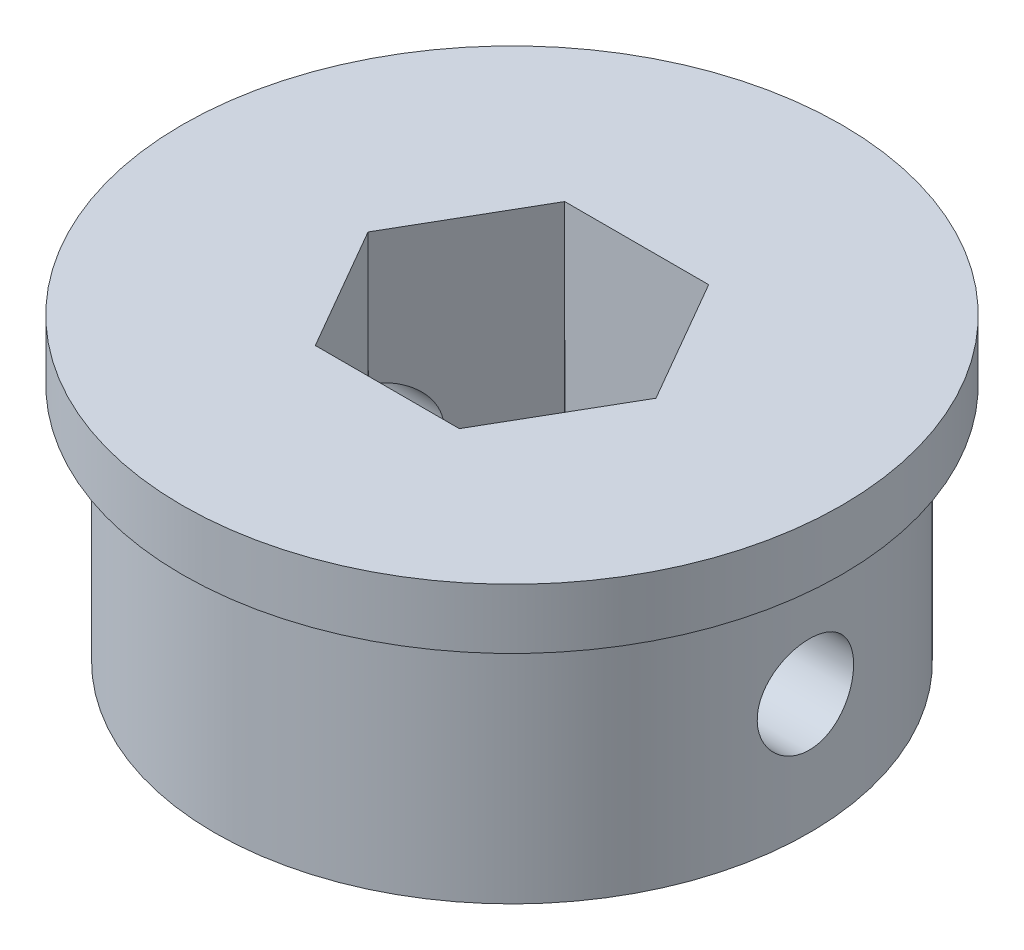
ISO-10303-21;
HEADER;
FILE_DESCRIPTION(('STEP AP214'),'2;1');
FILE_NAME('part.step','',(''),(''),'','','');
FILE_SCHEMA(('AUTOMOTIVE_DESIGN { 1 0 10303 214 1 1 1 1 }'));
ENDSEC;
DATA;
#1=APPLICATION_CONTEXT('core data for automotive mechanical design processes');
#2=APPLICATION_PROTOCOL_DEFINITION('international standard','automotive_design',2000,#1);
#3=PRODUCT_CONTEXT('',#1,'mechanical');
#4=PRODUCT('Part','Part','',(#3));
#5=PRODUCT_RELATED_PRODUCT_CATEGORY('part','',(#4));
#6=PRODUCT_DEFINITION_FORMATION('','',#4);
#7=PRODUCT_DEFINITION_CONTEXT('part definition',#1,'design');
#8=PRODUCT_DEFINITION('design','',#6,#7);
#9=PRODUCT_DEFINITION_SHAPE('','',#8);
#10=(LENGTH_UNIT() NAMED_UNIT(*) SI_UNIT(.MILLI.,.METRE.));
#11=(NAMED_UNIT(*) PLANE_ANGLE_UNIT() SI_UNIT($,.RADIAN.));
#12=(NAMED_UNIT(*) SI_UNIT($,.STERADIAN.) SOLID_ANGLE_UNIT());
#13=UNCERTAINTY_MEASURE_WITH_UNIT(LENGTH_MEASURE(1.E-05),#10,'distance_accuracy_value','');
#14=(GEOMETRIC_REPRESENTATION_CONTEXT(3) GLOBAL_UNCERTAINTY_ASSIGNED_CONTEXT((#13)) GLOBAL_UNIT_ASSIGNED_CONTEXT((#10,
#11,#12)) REPRESENTATION_CONTEXT('',''));
#15=CARTESIAN_POINT('',(0.,0.,0.));
#16=DIRECTION('',(0.,0.,1.));
#17=DIRECTION('',(1.,0.,0.));
#18=AXIS2_PLACEMENT_3D('',#15,#16,#17);
#19=CARTESIAN_POINT('',(0.,-9.525,0.));
#20=DIRECTION('',(0.,1.,0.));
#21=DIRECTION('',(0.,0.,1.));
#22=AXIS2_PLACEMENT_3D('',#19,#20,#21);
#23=CYLINDRICAL_SURFACE('',#22,7.62);
#24=DIRECTION('',(0.,-1.,0.));
#25=VECTOR('',#24,1.);
#26=CARTESIAN_POINT('',(7.6199937190736,7.67063178623506,-0.00978372520881203));
#27=LINE('',#26,#25);
#28=CARTESIAN_POINT('',(7.61999371907359,0.,-0.00978372520881116));
#29=VERTEX_POINT('',#28);
#30=CARTESIAN_POINT('',(7.6199937190736,-0.622318749095171,-0.00978372520881203));
#31=VERTEX_POINT('',#30);
#32=EDGE_CURVE('E214',#29,#31,#27,.T.);
#33=ORIENTED_EDGE('',*,*,#32,.T.);
#34=CARTESIAN_POINT('',(7.61999371907359,-0.622318749095171,-0.00978372520881133));
#35=CARTESIAN_POINT('',(7.61999790635786,-0.62230624969839,-0.00652248347254017));
#36=CARTESIAN_POINT('',(7.62,-0.622299999999999,-0.00326124173626901));
#37=CARTESIAN_POINT('',(7.62,-0.622299999999999,0.00326124173627332));
#38=CARTESIAN_POINT('',(7.61999790635786,-0.62230624969839,0.00652248347254449));
#39=CARTESIAN_POINT('',(7.61999371907359,-0.622318749095171,0.00978372520881565));
#40=B_SPLINE_CURVE_WITH_KNOTS('',3,(#34,#35,#36,#37,#38,#39),.UNSPECIFIED.,.F.,.F.,(4,2,4),(0.,
0.00978374518986359,0.0195674903797272),.UNSPECIFIED.);
#41=CARTESIAN_POINT('',(7.61999371907359,-0.622318749095171,0.00978372520881565));
#42=VERTEX_POINT('',#41);
#43=EDGE_CURVE('E67',#31,#42,#40,.T.);
#44=ORIENTED_EDGE('',*,*,#43,.T.);
#45=DIRECTION('',(0.,-1.,0.));
#46=VECTOR('',#45,1.);
#47=CARTESIAN_POINT('',(7.61999371907359,7.67063178623506,0.00978372520881506));
#48=LINE('',#47,#46);
#49=CARTESIAN_POINT('',(7.61999371907359,0.,0.00978372520880986));
#50=VERTEX_POINT('',#49);
#51=EDGE_CURVE('E261',#50,#42,#48,.T.);
#52=ORIENTED_EDGE('',*,*,#51,.F.);
#53=CARTESIAN_POINT('',(0.,0.,0.));
#54=DIRECTION('',(0.,1.,0.));
#55=DIRECTION('',(0.,0.,1.));
#56=AXIS2_PLACEMENT_3D('',#53,#54,#55);
#57=CIRCLE('',#56,7.62);
#58=EDGE_CURVE('E276',#50,#29,#57,.T.);
#59=ORIENTED_EDGE('',*,*,#58,.T.);
#60=EDGE_LOOP('',(#33,#44,#52,#59));
#61=FACE_BOUND('',#60,.T.);
#62=ADVANCED_FACE('F37',(#61),#23,.F.);
#63=DIRECTION('',(0.,-1.,0.));
#64=VECTOR('',#63,1.);
#65=CARTESIAN_POINT('',(-7.61999371907359,7.67063178623506,0.00978372520881506));
#66=LINE('',#65,#64);
#67=CARTESIAN_POINT('',(-7.61999371907359,0.,0.00978372520881723));
#68=VERTEX_POINT('',#67);
#69=CARTESIAN_POINT('',(-7.61999371907359,-0.622318749095171,0.00978372520881379));
#70=VERTEX_POINT('',#69);
#71=EDGE_CURVE('E246',#68,#70,#66,.T.);
#72=ORIENTED_EDGE('',*,*,#71,.T.);
#73=CARTESIAN_POINT('',(-7.61999371907359,-0.622318749095171,0.00978372520881379));
#74=CARTESIAN_POINT('',(-7.61999790635786,-0.62230624969839,0.00652248347254206));
#75=CARTESIAN_POINT('',(-7.62,-0.622299999999999,0.00326124173627033));
#76=CARTESIAN_POINT('',(-7.62,-0.622299999999999,-0.00326124173627313));
#77=CARTESIAN_POINT('',(-7.61999790635786,-0.62230624969839,-0.00652248347254486));
#78=CARTESIAN_POINT('',(-7.61999371907359,-0.622318749095171,-0.00978372520881659));
#79=B_SPLINE_CURVE_WITH_KNOTS('',3,(#73,#74,#75,#76,#77,#78),.UNSPECIFIED.,.F.,.F.,(4,2,4),(0.,
0.00978374518986528,0.0195674903797306),.UNSPECIFIED.);
#80=CARTESIAN_POINT('',(-7.61999371907359,-0.622318749095171,-0.0097837252088181));
#81=VERTEX_POINT('',#80);
#82=EDGE_CURVE('E377',#70,#81,#79,.T.);
#83=ORIENTED_EDGE('',*,*,#82,.T.);
#84=DIRECTION('',(0.,-1.,0.));
#85=VECTOR('',#84,1.);
#86=CARTESIAN_POINT('',(-7.61999371907359,7.67063178623506,-0.0097837252088181));
#87=LINE('',#86,#85);
#88=CARTESIAN_POINT('',(-7.61999371907359,0.,-0.0097837252088181));
#89=VERTEX_POINT('',#88);
#90=EDGE_CURVE('E233',#89,#81,#87,.T.);
#91=ORIENTED_EDGE('',*,*,#90,.F.);
#92=EDGE_CURVE('E435',#89,#68,#57,.T.);
#93=ORIENTED_EDGE('',*,*,#92,.T.);
#94=EDGE_LOOP('',(#72,#83,#91,#93));
#95=FACE_BOUND('',#94,.T.);
#96=ADVANCED_FACE('F461',(#95),#23,.F.);
#97=CARTESIAN_POINT('',(7.61999371907359,-5.72768125090483,0.00978372520881565));
#98=VERTEX_POINT('',#97);
#99=CARTESIAN_POINT('',(7.61999371907359,-9.525,0.00978372520881506));
#100=VERTEX_POINT('',#99);
#101=EDGE_CURVE('E207',#98,#100,#48,.T.);
#102=ORIENTED_EDGE('',*,*,#101,.F.);
#103=CARTESIAN_POINT('',(7.61999371907359,-5.72768125090483,0.00978372520881565));
#104=CARTESIAN_POINT('',(7.61999790635786,-5.72769375030161,0.00652248347254449));
#105=CARTESIAN_POINT('',(7.62,-5.7277,0.00326124173627332));
#106=CARTESIAN_POINT('',(7.62,-5.7277,-0.00326124173626901));
#107=CARTESIAN_POINT('',(7.61999790635786,-5.72769375030161,-0.00652248347254017));
#108=CARTESIAN_POINT('',(7.61999371907359,-5.72768125090483,-0.00978372520881134));
#109=B_SPLINE_CURVE_WITH_KNOTS('',3,(#103,#104,#105,#106,#107,#108),.UNSPECIFIED.,.F.,.F.,(4,2,
4),(0.,0.00978374518986359,0.0195674903797272),.UNSPECIFIED.);
#110=CARTESIAN_POINT('',(7.6199937190736,-5.72768125090483,-0.00978372520881203));
#111=VERTEX_POINT('',#110);
#112=EDGE_CURVE('E194',#98,#111,#109,.T.);
#113=ORIENTED_EDGE('',*,*,#112,.T.);
#114=CARTESIAN_POINT('',(7.61999371907359,-9.525,-0.00978372520881203));
#115=VERTEX_POINT('',#114);
#116=EDGE_CURVE('E205',#111,#115,#27,.T.);
#117=ORIENTED_EDGE('',*,*,#116,.T.);
#118=CARTESIAN_POINT('',(0.,-9.525,0.));
#119=DIRECTION('',(0.,1.,0.));
#120=DIRECTION('',(0.,0.,1.));
#121=AXIS2_PLACEMENT_3D('',#118,#119,#120);
#122=CIRCLE('',#121,7.62);
#123=EDGE_CURVE('E268',#100,#115,#122,.T.);
#124=ORIENTED_EDGE('',*,*,#123,.F.);
#125=EDGE_LOOP('',(#102,#113,#117,#124));
#126=FACE_BOUND('',#125,.T.);
#127=ADVANCED_FACE('F203',(#126),#23,.F.);
#128=CARTESIAN_POINT('',(3.81846981411128,-9.525,-6.59421627479119));
#129=VERTEX_POINT('',#128);
#130=CARTESIAN_POINT('',(3.80152390496231,-9.525,-6.604));
#131=VERTEX_POINT('',#130);
#132=EDGE_CURVE('E271',#129,#131,#122,.T.);
#133=ORIENTED_EDGE('',*,*,#132,.F.);
#134=DIRECTION('',(0.,-1.,0.));
#135=VECTOR('',#134,1.);
#136=CARTESIAN_POINT('',(3.81846981411128,7.67063178623506,-6.59421627479119));
#137=LINE('',#136,#135);
#138=CARTESIAN_POINT('',(3.81846981411128,0.,-6.59421627479119));
#139=VERTEX_POINT('',#138);
#140=EDGE_CURVE('E215',#139,#129,#137,.T.);
#141=ORIENTED_EDGE('',*,*,#140,.F.);
#142=CARTESIAN_POINT('',(3.80152390496231,0.,-6.604));
#143=VERTEX_POINT('',#142);
#144=EDGE_CURVE('E430',#139,#143,#57,.T.);
#145=ORIENTED_EDGE('',*,*,#144,.T.);
#146=DIRECTION('',(0.,-1.,0.));
#147=VECTOR('',#146,1.);
#148=CARTESIAN_POINT('',(3.80152390496231,7.67063178623506,-6.604));
#149=LINE('',#148,#147);
#150=EDGE_CURVE('E226',#143,#131,#149,.T.);
#151=ORIENTED_EDGE('',*,*,#150,.T.);
#152=EDGE_LOOP('',(#133,#141,#145,#151));
#153=FACE_BOUND('',#152,.T.);
#154=ADVANCED_FACE('F493',(#153),#23,.F.);
#155=CARTESIAN_POINT('',(-3.80152390496231,-9.525,-6.604));
#156=VERTEX_POINT('',#155);
#157=CARTESIAN_POINT('',(-3.81846981411128,-9.525,-6.59421627479118));
#158=VERTEX_POINT('',#157);
#159=EDGE_CURVE('E451',#156,#158,#122,.T.);
#160=ORIENTED_EDGE('',*,*,#159,.F.);
#161=DIRECTION('',(0.,-1.,0.));
#162=VECTOR('',#161,1.);
#163=CARTESIAN_POINT('',(-3.80152390496231,7.67063178623506,-6.604));
#164=LINE('',#163,#162);
#165=CARTESIAN_POINT('',(-3.80152390496231,0.,-6.604));
#166=VERTEX_POINT('',#165);
#167=EDGE_CURVE('E223',#166,#156,#164,.T.);
#168=ORIENTED_EDGE('',*,*,#167,.F.);
#169=CARTESIAN_POINT('',(-3.81846981411128,0.,-6.59421627479119));
#170=VERTEX_POINT('',#169);
#171=EDGE_CURVE('E431',#166,#170,#57,.T.);
#172=ORIENTED_EDGE('',*,*,#171,.T.);
#173=DIRECTION('',(0.,-1.,0.));
#174=VECTOR('',#173,1.);
#175=CARTESIAN_POINT('',(-3.81846981411128,7.67063178623506,-6.59421627479118));
#176=LINE('',#175,#174);
#177=EDGE_CURVE('E236',#170,#158,#176,.T.);
#178=ORIENTED_EDGE('',*,*,#177,.T.);
#179=EDGE_LOOP('',(#160,#168,#172,#178));
#180=FACE_BOUND('',#179,.T.);
#181=ADVANCED_FACE('F455',(#180),#23,.F.);
#182=CARTESIAN_POINT('',(-7.61999371907359,-5.72768125090483,-0.0097837252088181));
#183=VERTEX_POINT('',#182);
#184=CARTESIAN_POINT('',(-7.61999371907359,-9.525,-0.0097837252088181));
#185=VERTEX_POINT('',#184);
#186=EDGE_CURVE('E232',#183,#185,#87,.T.);
#187=ORIENTED_EDGE('',*,*,#186,.F.);
#188=CARTESIAN_POINT('',(-7.61999371907359,-5.72768125090483,-0.00978372520881658));
#189=CARTESIAN_POINT('',(-7.61999790635786,-5.72769375030161,-0.00652248347254486));
#190=CARTESIAN_POINT('',(-7.62,-5.7277,-0.00326124173627313));
#191=CARTESIAN_POINT('',(-7.62,-5.7277,0.00326124173627033));
#192=CARTESIAN_POINT('',(-7.61999790635786,-5.72769375030161,0.00652248347254206));
#193=CARTESIAN_POINT('',(-7.61999371907359,-5.72768125090483,0.00978372520881379));
#194=B_SPLINE_CURVE_WITH_KNOTS('',3,(#188,#189,#190,#191,#192,#193),.UNSPECIFIED.,.F.,.F.,(4,2,
4),(0.,0.00978374518986528,0.0195674903797306),.UNSPECIFIED.);
#195=CARTESIAN_POINT('',(-7.61999371907359,-5.72768125090483,0.00978372520881379));
#196=VERTEX_POINT('',#195);
#197=EDGE_CURVE('E59',#183,#196,#194,.T.);
#198=ORIENTED_EDGE('',*,*,#197,.T.);
#199=CARTESIAN_POINT('',(-7.61999371907359,-9.525,0.00978372520881506));
#200=VERTEX_POINT('',#199);
#201=EDGE_CURVE('E245',#196,#200,#66,.T.);
#202=ORIENTED_EDGE('',*,*,#201,.T.);
#203=EDGE_CURVE('E450',#185,#200,#122,.T.);
#204=ORIENTED_EDGE('',*,*,#203,.F.);
#205=EDGE_LOOP('',(#187,#198,#202,#204));
#206=FACE_BOUND('',#205,.T.);
#207=ADVANCED_FACE('F458',(#206),#23,.F.);
#208=CARTESIAN_POINT('',(-3.81846981411128,-9.525,6.59421627479119));
#209=VERTEX_POINT('',#208);
#210=CARTESIAN_POINT('',(-3.80152390496231,-9.525,6.604));
#211=VERTEX_POINT('',#210);
#212=EDGE_CURVE('E447',#209,#211,#122,.T.);
#213=ORIENTED_EDGE('',*,*,#212,.F.);
#214=DIRECTION('',(0.,-1.,0.));
#215=VECTOR('',#214,1.);
#216=CARTESIAN_POINT('',(-3.81846981411128,7.67063178623506,6.59421627479119));
#217=LINE('',#216,#215);
#218=CARTESIAN_POINT('',(-3.81846981411128,0.,6.59421627479119));
#219=VERTEX_POINT('',#218);
#220=EDGE_CURVE('E242',#219,#209,#217,.T.);
#221=ORIENTED_EDGE('',*,*,#220,.F.);
#222=CARTESIAN_POINT('',(-3.80152390496232,0.,6.604));
#223=VERTEX_POINT('',#222);
#224=EDGE_CURVE('E267',#219,#223,#57,.T.);
#225=ORIENTED_EDGE('',*,*,#224,.T.);
#226=DIRECTION('',(0.,-1.,0.));
#227=VECTOR('',#226,1.);
#228=CARTESIAN_POINT('',(-3.80152390496232,7.67063178623506,6.604));
#229=LINE('',#228,#227);
#230=EDGE_CURVE('E255',#223,#211,#229,.T.);
#231=ORIENTED_EDGE('',*,*,#230,.T.);
#232=EDGE_LOOP('',(#213,#221,#225,#231));
#233=FACE_BOUND('',#232,.T.);
#234=ADVANCED_FACE('F443',(#233),#23,.F.);
#235=CARTESIAN_POINT('',(0.,0.,0.));
#236=DIRECTION('',(0.,1.,0.));
#237=DIRECTION('',(0.,0.,1.));
#238=AXIS2_PLACEMENT_3D('',#235,#236,#237);
#239=PLANE('',#238);
#240=CARTESIAN_POINT('',(3.80152390496231,0.,6.604));
#241=VERTEX_POINT('',#240);
#242=CARTESIAN_POINT('',(3.81846981411128,0.,6.59421627479119));
#243=VERTEX_POINT('',#242);
#244=EDGE_CURVE('E273',#241,#243,#57,.T.);
#245=ORIENTED_EDGE('',*,*,#244,.F.);
#246=DIRECTION('',(1.,0.,0.));
#247=VECTOR('',#246,1.);
#248=CARTESIAN_POINT('',(0.,0.,6.604));
#249=LINE('',#248,#247);
#250=CARTESIAN_POINT('',(3.81282117772829,0.,6.604));
#251=VERTEX_POINT('',#250);
#252=EDGE_CURVE('E309',#241,#251,#249,.T.);
#253=ORIENTED_EDGE('',*,*,#252,.T.);
#254=DIRECTION('',(0.5,0.,-0.866025403784439));
#255=VECTOR('',#254,1.);
#256=CARTESIAN_POINT('',(5.71923176659243,0.,3.302));
#257=LINE('',#256,#255);
#258=EDGE_CURVE('E306',#251,#243,#257,.T.);
#259=ORIENTED_EDGE('',*,*,#258,.T.);
#260=EDGE_LOOP('',(#245,#253,#259));
#261=FACE_BOUND('',#260,.T.);
#262=ADVANCED_FACE('F397',(#261),#239,.T.);
#263=ORIENTED_EDGE('',*,*,#58,.F.);
#264=CARTESIAN_POINT('',(7.62564235545658,0.,0.));
#265=VERTEX_POINT('',#264);
#266=EDGE_CURVE('E283',#50,#265,#257,.T.);
#267=ORIENTED_EDGE('',*,*,#266,.T.);
#268=DIRECTION('',(-0.5,0.,-0.866025403784439));
#269=VECTOR('',#268,1.);
#270=CARTESIAN_POINT('',(5.71923176659243,0.,-3.302));
#271=LINE('',#270,#269);
#272=EDGE_CURVE('E290',#265,#29,#271,.T.);
#273=ORIENTED_EDGE('',*,*,#272,.T.);
#274=EDGE_LOOP('',(#263,#267,#273));
#275=FACE_BOUND('',#274,.T.);
#276=ADVANCED_FACE('F428',(#275),#239,.T.);
#277=ORIENTED_EDGE('',*,*,#144,.F.);
#278=CARTESIAN_POINT('',(3.81282117772829,0.,-6.604));
#279=VERTEX_POINT('',#278);
#280=EDGE_CURVE('E325',#139,#279,#271,.T.);
#281=ORIENTED_EDGE('',*,*,#280,.T.);
#282=DIRECTION('',(-1.,0.,0.));
#283=VECTOR('',#282,1.);
#284=CARTESIAN_POINT('',(0.,0.,-6.604));
#285=LINE('',#284,#283);
#286=EDGE_CURVE('E322',#279,#143,#285,.T.);
#287=ORIENTED_EDGE('',*,*,#286,.T.);
#288=EDGE_LOOP('',(#277,#281,#287));
#289=FACE_BOUND('',#288,.T.);
#290=ADVANCED_FACE('F471',(#289),#239,.T.);
#291=ORIENTED_EDGE('',*,*,#171,.F.);
#292=CARTESIAN_POINT('',(-3.81282117772829,0.,-6.604));
#293=VERTEX_POINT('',#292);
#294=EDGE_CURVE('E321',#166,#293,#285,.T.);
#295=ORIENTED_EDGE('',*,*,#294,.T.);
#296=DIRECTION('',(-0.5,0.,0.866025403784439));
#297=VECTOR('',#296,1.);
#298=CARTESIAN_POINT('',(-5.71923176659244,0.,-3.302));
#299=LINE('',#298,#297);
#300=EDGE_CURVE('E318',#293,#170,#299,.T.);
#301=ORIENTED_EDGE('',*,*,#300,.T.);
#302=EDGE_LOOP('',(#291,#295,#301));
#303=FACE_BOUND('',#302,.T.);
#304=ADVANCED_FACE('F465',(#303),#239,.T.);
#305=ORIENTED_EDGE('',*,*,#92,.F.);
#306=CARTESIAN_POINT('',(-7.62564235545658,0.,0.));
#307=VERTEX_POINT('',#306);
#308=EDGE_CURVE('E317',#89,#307,#299,.T.);
#309=ORIENTED_EDGE('',*,*,#308,.T.);
#310=DIRECTION('',(0.5,0.,0.866025403784439));
#311=VECTOR('',#310,1.);
#312=CARTESIAN_POINT('',(-5.71923176659244,0.,3.302));
#313=LINE('',#312,#311);
#314=EDGE_CURVE('E314',#307,#68,#313,.T.);
#315=ORIENTED_EDGE('',*,*,#314,.T.);
#316=EDGE_LOOP('',(#305,#309,#315));
#317=FACE_BOUND('',#316,.T.);
#318=ADVANCED_FACE('F463',(#317),#239,.T.);
#319=CARTESIAN_POINT('',(5.71923176659243,6.35,3.302));
#320=DIRECTION('',(-0.866025403784439,0.,-0.5));
#321=DIRECTION('',(-0.5,0.,0.866025403784439));
#322=AXIS2_PLACEMENT_3D('',#319,#320,#321);
#323=PLANE('',#322);
#324=CARTESIAN_POINT('',(7.62564235545658,-3.175,0.));
#325=DIRECTION('',(-0.866025403784439,0.,-0.5));
#326=DIRECTION('',(0.5,0.,-0.866025403784439));
#327=AXIS2_PLACEMENT_3D('',#324,#325,#326);
#328=ELLIPSE('',#327,2.94760406432072,2.5527);
#329=EDGE_CURVE('E727',#98,#42,#328,.T.);
#330=ORIENTED_EDGE('',*,*,#329,.F.);
#331=ORIENTED_EDGE('',*,*,#101,.T.);
#332=DIRECTION('',(0.5,0.,-0.866025403784439));
#333=VECTOR('',#332,1.);
#334=CARTESIAN_POINT('',(5.71923176659244,-9.525,3.302));
#335=LINE('',#334,#333);
#336=CARTESIAN_POINT('',(3.81846981411128,-9.525,6.59421627479119));
#337=VERTEX_POINT('',#336);
#338=EDGE_CURVE('E258',#337,#100,#335,.T.);
#339=ORIENTED_EDGE('',*,*,#338,.F.);
#340=DIRECTION('',(0.,-1.,0.));
#341=VECTOR('',#340,1.);
#342=CARTESIAN_POINT('',(3.81846981411128,7.67063178623506,6.59421627479119));
#343=LINE('',#342,#341);
#344=EDGE_CURVE('E264',#243,#337,#343,.T.);
#345=ORIENTED_EDGE('',*,*,#344,.F.);
#346=ORIENTED_EDGE('',*,*,#258,.F.);
#347=DIRECTION('',(0.,-1.,0.));
#348=VECTOR('',#347,1.);
#349=CARTESIAN_POINT('',(3.81282117772829,6.35,6.604));
#350=LINE('',#349,#348);
#351=CARTESIAN_POINT('',(3.81282117772829,6.35,6.604));
#352=VERTEX_POINT('',#351);
#353=EDGE_CURVE('E51',#352,#251,#350,.T.);
#354=ORIENTED_EDGE('',*,*,#353,.F.);
#355=DIRECTION('',(0.5,0.,-0.866025403784439));
#356=VECTOR('',#355,1.);
#357=CARTESIAN_POINT('',(5.71923176659243,6.35,3.302));
#358=LINE('',#357,#356);
#359=CARTESIAN_POINT('',(7.62564235545658,6.35,0.));
#360=VERTEX_POINT('',#359);
#361=EDGE_CURVE('E286',#352,#360,#358,.T.);
#362=ORIENTED_EDGE('',*,*,#361,.T.);
#363=DIRECTION('',(0.,-1.,0.));
#364=VECTOR('',#363,1.);
#365=CARTESIAN_POINT('',(7.62564235545658,6.35,0.));
#366=LINE('',#365,#364);
#367=EDGE_CURVE('E305',#360,#265,#366,.T.);
#368=ORIENTED_EDGE('',*,*,#367,.T.);
#369=ORIENTED_EDGE('',*,*,#266,.F.);
#370=ORIENTED_EDGE('',*,*,#51,.T.);
#371=EDGE_LOOP('',(#330,#331,#339,#345,#346,#354,#362,#368,#369,#370));
#372=FACE_BOUND('',#371,.T.);
#373=ADVANCED_FACE('F391',(#372),#323,.T.);
#374=CARTESIAN_POINT('',(0.,6.35,6.604));
#375=DIRECTION('',(0.,0.,-1.));
#376=DIRECTION('',(-1.,0.,0.));
#377=AXIS2_PLACEMENT_3D('',#374,#375,#376);
#378=PLANE('',#377);
#379=CARTESIAN_POINT('',(-3.81282117772829,0.,6.604));
#380=VERTEX_POINT('',#379);
#381=EDGE_CURVE('E310',#380,#223,#249,.T.);
#382=ORIENTED_EDGE('',*,*,#381,.F.);
#383=DIRECTION('',(0.,-1.,0.));
#384=VECTOR('',#383,1.);
#385=CARTESIAN_POINT('',(-3.81282117772829,6.35,6.604));
#386=LINE('',#385,#384);
#387=CARTESIAN_POINT('',(-3.81282117772829,6.35,6.604));
#388=VERTEX_POINT('',#387);
#389=EDGE_CURVE('E339',#388,#380,#386,.T.);
#390=ORIENTED_EDGE('',*,*,#389,.F.);
#391=DIRECTION('',(1.,0.,0.));
#392=VECTOR('',#391,1.);
#393=CARTESIAN_POINT('',(0.,6.35,6.604));
#394=LINE('',#393,#392);
#395=EDGE_CURVE('E289',#388,#352,#394,.T.);
#396=ORIENTED_EDGE('',*,*,#395,.T.);
#397=ORIENTED_EDGE('',*,*,#353,.T.);
#398=ORIENTED_EDGE('',*,*,#252,.F.);
#399=DIRECTION('',(0.,-1.,0.));
#400=VECTOR('',#399,1.);
#401=CARTESIAN_POINT('',(3.80152390496231,7.67063178623506,6.604));
#402=LINE('',#401,#400);
#403=CARTESIAN_POINT('',(3.80152390496231,-9.525,6.60400000000001));
#404=VERTEX_POINT('',#403);
#405=EDGE_CURVE('E252',#241,#404,#402,.T.);
#406=ORIENTED_EDGE('',*,*,#405,.T.);
#407=DIRECTION('',(1.,0.,0.));
#408=VECTOR('',#407,1.);
#409=CARTESIAN_POINT('',(0.,-9.525,6.604));
#410=LINE('',#409,#408);
#411=EDGE_CURVE('E249',#211,#404,#410,.T.);
#412=ORIENTED_EDGE('',*,*,#411,.F.);
#413=ORIENTED_EDGE('',*,*,#230,.F.);
#414=EDGE_LOOP('',(#382,#390,#396,#397,#398,#406,#412,#413));
#415=FACE_BOUND('',#414,.T.);
#416=ADVANCED_FACE('F408',(#415),#378,.T.);
#417=CARTESIAN_POINT('',(-5.71923176659244,6.35,3.302));
#418=DIRECTION('',(0.866025403784439,0.,-0.5));
#419=DIRECTION('',(-0.5,0.,-0.866025403784439));
#420=AXIS2_PLACEMENT_3D('',#417,#418,#419);
#421=PLANE('',#420);
#422=CARTESIAN_POINT('',(-7.62564235545658,-3.175,0.));
#423=DIRECTION('',(0.866025403784439,0.,-0.5));
#424=DIRECTION('',(0.5,0.,0.866025403784439));
#425=AXIS2_PLACEMENT_3D('',#422,#423,#424);
#426=ELLIPSE('',#425,2.94760406432072,2.5527);
#427=EDGE_CURVE('E385',#70,#196,#426,.T.);
#428=ORIENTED_EDGE('',*,*,#427,.F.);
#429=ORIENTED_EDGE('',*,*,#71,.F.);
#430=ORIENTED_EDGE('',*,*,#314,.F.);
#431=DIRECTION('',(0.,-1.,0.));
#432=VECTOR('',#431,1.);
#433=CARTESIAN_POINT('',(-7.62564235545658,6.35,0.));
#434=LINE('',#433,#432);
#435=CARTESIAN_POINT('',(-7.62564235545658,6.35,0.));
#436=VERTEX_POINT('',#435);
#437=EDGE_CURVE('E336',#436,#307,#434,.T.);
#438=ORIENTED_EDGE('',*,*,#437,.F.);
#439=DIRECTION('',(0.5,0.,0.866025403784439));
#440=VECTOR('',#439,1.);
#441=CARTESIAN_POINT('',(-5.71923176659244,6.35,3.302));
#442=LINE('',#441,#440);
#443=EDGE_CURVE('E293',#436,#388,#442,.T.);
#444=ORIENTED_EDGE('',*,*,#443,.T.);
#445=ORIENTED_EDGE('',*,*,#389,.T.);
#446=EDGE_CURVE('E313',#219,#380,#313,.T.);
#447=ORIENTED_EDGE('',*,*,#446,.F.);
#448=ORIENTED_EDGE('',*,*,#220,.T.);
#449=DIRECTION('',(0.5,0.,0.866025403784439));
#450=VECTOR('',#449,1.);
#451=CARTESIAN_POINT('',(-5.71923176659244,-9.525,3.302));
#452=LINE('',#451,#450);
#453=EDGE_CURVE('E239',#200,#209,#452,.T.);
#454=ORIENTED_EDGE('',*,*,#453,.F.);
#455=ORIENTED_EDGE('',*,*,#201,.F.);
#456=EDGE_LOOP('',(#428,#429,#430,#438,#444,#445,#447,#448,#454,#455));
#457=FACE_BOUND('',#456,.T.);
#458=ADVANCED_FACE('F412',(#457),#421,.T.);
#459=CARTESIAN_POINT('',(-5.71923176659244,6.35,-3.302));
#460=DIRECTION('',(0.866025403784439,0.,0.5));
#461=DIRECTION('',(0.5,0.,-0.866025403784439));
#462=AXIS2_PLACEMENT_3D('',#459,#460,#461);
#463=PLANE('',#462);
#464=CARTESIAN_POINT('',(-7.62564235545658,-3.175,0.));
#465=DIRECTION('',(0.866025403784439,0.,0.5));
#466=DIRECTION('',(0.5,0.,-0.866025403784439));
#467=AXIS2_PLACEMENT_3D('',#464,#465,#466);
#468=ELLIPSE('',#467,2.94760406432072,2.5527);
#469=EDGE_CURVE('E378',#183,#81,#468,.T.);
#470=ORIENTED_EDGE('',*,*,#469,.F.);
#471=ORIENTED_EDGE('',*,*,#186,.T.);
#472=DIRECTION('',(-0.5,0.,0.866025403784439));
#473=VECTOR('',#472,1.);
#474=CARTESIAN_POINT('',(-5.71923176659244,-9.525,-3.302));
#475=LINE('',#474,#473);
#476=EDGE_CURVE('E229',#158,#185,#475,.T.);
#477=ORIENTED_EDGE('',*,*,#476,.F.);
#478=ORIENTED_EDGE('',*,*,#177,.F.);
#479=ORIENTED_EDGE('',*,*,#300,.F.);
#480=DIRECTION('',(0.,-1.,0.));
#481=VECTOR('',#480,1.);
#482=CARTESIAN_POINT('',(-3.81282117772829,6.35,-6.604));
#483=LINE('',#482,#481);
#484=CARTESIAN_POINT('',(-3.81282117772829,6.35,-6.604));
#485=VERTEX_POINT('',#484);
#486=EDGE_CURVE('E333',#485,#293,#483,.T.);
#487=ORIENTED_EDGE('',*,*,#486,.F.);
#488=DIRECTION('',(-0.5,0.,0.866025403784439));
#489=VECTOR('',#488,1.);
#490=CARTESIAN_POINT('',(-5.71923176659244,6.35,-3.302));
#491=LINE('',#490,#489);
#492=EDGE_CURVE('E296',#485,#436,#491,.T.);
#493=ORIENTED_EDGE('',*,*,#492,.T.);
#494=ORIENTED_EDGE('',*,*,#437,.T.);
#495=ORIENTED_EDGE('',*,*,#308,.F.);
#496=ORIENTED_EDGE('',*,*,#90,.T.);
#497=EDGE_LOOP('',(#470,#471,#477,#478,#479,#487,#493,#494,#495,#496));
#498=FACE_BOUND('',#497,.T.);
#499=ADVANCED_FACE('F417',(#498),#463,.T.);
#500=CARTESIAN_POINT('',(0.,6.35,-6.604));
#501=DIRECTION('',(0.,0.,1.));
#502=DIRECTION('',(1.,0.,0.));
#503=AXIS2_PLACEMENT_3D('',#500,#501,#502);
#504=PLANE('',#503);
#505=ORIENTED_EDGE('',*,*,#286,.F.);
#506=DIRECTION('',(0.,-1.,0.));
#507=VECTOR('',#506,1.);
#508=CARTESIAN_POINT('',(3.81282117772829,6.35,-6.604));
#509=LINE('',#508,#507);
#510=CARTESIAN_POINT('',(3.81282117772829,6.35,-6.604));
#511=VERTEX_POINT('',#510);
#512=EDGE_CURVE('E330',#511,#279,#509,.T.);
#513=ORIENTED_EDGE('',*,*,#512,.F.);
#514=DIRECTION('',(-1.,0.,0.));
#515=VECTOR('',#514,1.);
#516=CARTESIAN_POINT('',(0.,6.35,-6.604));
#517=LINE('',#516,#515);
#518=EDGE_CURVE('E299',#511,#485,#517,.T.);
#519=ORIENTED_EDGE('',*,*,#518,.T.);
#520=ORIENTED_EDGE('',*,*,#486,.T.);
#521=ORIENTED_EDGE('',*,*,#294,.F.);
#522=ORIENTED_EDGE('',*,*,#167,.T.);
#523=DIRECTION('',(-1.,0.,0.));
#524=VECTOR('',#523,1.);
#525=CARTESIAN_POINT('',(0.,-9.525,-6.604));
#526=LINE('',#525,#524);
#527=EDGE_CURVE('E217',#131,#156,#526,.T.);
#528=ORIENTED_EDGE('',*,*,#527,.F.);
#529=ORIENTED_EDGE('',*,*,#150,.F.);
#530=EDGE_LOOP('',(#505,#513,#519,#520,#521,#522,#528,#529));
#531=FACE_BOUND('',#530,.T.);
#532=ADVANCED_FACE('F422',(#531),#504,.T.);
#533=CARTESIAN_POINT('',(5.71923176659243,6.35,-3.302));
#534=DIRECTION('',(-0.866025403784439,0.,0.5));
#535=DIRECTION('',(0.5,0.,0.866025403784439));
#536=AXIS2_PLACEMENT_3D('',#533,#534,#535);
#537=PLANE('',#536);
#538=CARTESIAN_POINT('',(7.62564235545658,-3.175,0.));
#539=DIRECTION('',(-0.866025403784439,0.,0.5));
#540=DIRECTION('',(0.5,0.,0.866025403784439));
#541=AXIS2_PLACEMENT_3D('',#538,#539,#540);
#542=ELLIPSE('',#541,2.94760406432072,2.5527);
#543=EDGE_CURVE('E190',#31,#111,#542,.T.);
#544=ORIENTED_EDGE('',*,*,#543,.F.);
#545=ORIENTED_EDGE('',*,*,#32,.F.);
#546=ORIENTED_EDGE('',*,*,#272,.F.);
#547=ORIENTED_EDGE('',*,*,#367,.F.);
#548=DIRECTION('',(-0.5,0.,-0.866025403784439));
#549=VECTOR('',#548,1.);
#550=CARTESIAN_POINT('',(5.71923176659243,6.35,-3.302));
#551=LINE('',#550,#549);
#552=EDGE_CURVE('E302',#360,#511,#551,.T.);
#553=ORIENTED_EDGE('',*,*,#552,.T.);
#554=ORIENTED_EDGE('',*,*,#512,.T.);
#555=ORIENTED_EDGE('',*,*,#280,.F.);
#556=ORIENTED_EDGE('',*,*,#140,.T.);
#557=DIRECTION('',(-0.5,0.,-0.866025403784439));
#558=VECTOR('',#557,1.);
#559=CARTESIAN_POINT('',(5.71923176659243,-9.525,-3.302));
#560=LINE('',#559,#558);
#561=EDGE_CURVE('E213',#115,#129,#560,.T.);
#562=ORIENTED_EDGE('',*,*,#561,.F.);
#563=ORIENTED_EDGE('',*,*,#116,.F.);
#564=EDGE_LOOP('',(#544,#545,#546,#547,#553,#554,#555,#556,#562,#563));
#565=FACE_BOUND('',#564,.T.);
#566=ADVANCED_FACE('F210',(#565),#537,.T.);
#567=CARTESIAN_POINT('',(0.,6.35,0.));
#568=DIRECTION('',(0.,1.,0.));
#569=DIRECTION('',(0.,0.,1.));
#570=AXIS2_PLACEMENT_3D('',#567,#568,#569);
#571=PLANE('',#570);
#572=ORIENTED_EDGE('',*,*,#361,.F.);
#573=ORIENTED_EDGE('',*,*,#395,.F.);
#574=ORIENTED_EDGE('',*,*,#443,.F.);
#575=ORIENTED_EDGE('',*,*,#492,.F.);
#576=ORIENTED_EDGE('',*,*,#518,.F.);
#577=ORIENTED_EDGE('',*,*,#552,.F.);
#578=EDGE_LOOP('',(#572,#573,#574,#575,#576,#577));
#579=FACE_BOUND('',#578,.T.);
#580=CARTESIAN_POINT('',(0.,6.35,0.));
#581=DIRECTION('',(0.,1.,0.));
#582=DIRECTION('',(0.,0.,1.));
#583=AXIS2_PLACEMENT_3D('',#580,#581,#582);
#584=CIRCLE('',#583,17.4625);
#585=CARTESIAN_POINT('',(0.,6.35,17.4625));
#586=VERTEX_POINT('',#585);
#587=EDGE_CURVE('E279',#586,#586,#584,.T.);
#588=ORIENTED_EDGE('',*,*,#587,.T.);
#589=EDGE_LOOP('',(#588));
#590=FACE_BOUND('',#589,.T.);
#591=ADVANCED_FACE('F403',(#579,#590),#571,.T.);
#592=ORIENTED_EDGE('',*,*,#224,.F.);
#593=ORIENTED_EDGE('',*,*,#446,.T.);
#594=ORIENTED_EDGE('',*,*,#381,.T.);
#595=EDGE_LOOP('',(#592,#593,#594));
#596=FACE_BOUND('',#595,.T.);
#597=ADVANCED_FACE('F446',(#596),#239,.T.);
#598=CARTESIAN_POINT('',(0.,3.175,0.));
#599=DIRECTION('',(0.,1.,0.));
#600=DIRECTION('',(0.,0.,1.));
#601=AXIS2_PLACEMENT_3D('',#598,#599,#600);
#602=CYLINDRICAL_SURFACE('',#601,17.4625);
#603=CARTESIAN_POINT('',(0.,3.175,0.));
#604=DIRECTION('',(0.,1.,0.));
#605=DIRECTION('',(0.,0.,1.));
#606=AXIS2_PLACEMENT_3D('',#603,#604,#605);
#607=CIRCLE('',#606,17.4625);
#608=CARTESIAN_POINT('',(0.,3.175,17.4625));
#609=VERTEX_POINT('',#608);
#610=EDGE_CURVE('E280',#609,#609,#607,.T.);
#611=ORIENTED_EDGE('',*,*,#610,.T.);
#612=EDGE_LOOP('',(#611));
#613=FACE_BOUND('',#612,.T.);
#614=ORIENTED_EDGE('',*,*,#587,.F.);
#615=EDGE_LOOP('',(#614));
#616=FACE_BOUND('',#615,.T.);
#617=ADVANCED_FACE('F475',(#613,#616),#602,.T.);
#618=CARTESIAN_POINT('',(0.,3.175,0.));
#619=DIRECTION('',(0.,1.,0.));
#620=DIRECTION('',(0.,0.,1.));
#621=AXIS2_PLACEMENT_3D('',#618,#619,#620);
#622=PLANE('',#621);
#623=CARTESIAN_POINT('',(0.,3.175,0.));
#624=DIRECTION('',(0.,1.,0.));
#625=DIRECTION('',(0.,0.,1.));
#626=AXIS2_PLACEMENT_3D('',#623,#624,#625);
#627=CIRCLE('',#626,15.748);
#628=CARTESIAN_POINT('',(0.,3.175,15.748));
#629=VERTEX_POINT('',#628);
#630=EDGE_CURVE('E270',#629,#629,#627,.T.);
#631=ORIENTED_EDGE('',*,*,#630,.T.);
#632=EDGE_LOOP('',(#631));
#633=FACE_BOUND('',#632,.T.);
#634=ORIENTED_EDGE('',*,*,#610,.F.);
#635=EDGE_LOOP('',(#634));
#636=FACE_BOUND('',#635,.T.);
#637=ADVANCED_FACE('F532',(#633,#636),#622,.F.);
#638=CARTESIAN_POINT('',(0.,-9.525,0.));
#639=DIRECTION('',(0.,1.,0.));
#640=DIRECTION('',(0.,0.,1.));
#641=AXIS2_PLACEMENT_3D('',#638,#639,#640);
#642=PLANE('',#641);
#643=ORIENTED_EDGE('',*,*,#123,.T.);
#644=ORIENTED_EDGE('',*,*,#561,.T.);
#645=ORIENTED_EDGE('',*,*,#132,.T.);
#646=ORIENTED_EDGE('',*,*,#527,.T.);
#647=ORIENTED_EDGE('',*,*,#159,.T.);
#648=ORIENTED_EDGE('',*,*,#476,.T.);
#649=ORIENTED_EDGE('',*,*,#203,.T.);
#650=ORIENTED_EDGE('',*,*,#453,.T.);
#651=ORIENTED_EDGE('',*,*,#212,.T.);
#652=ORIENTED_EDGE('',*,*,#411,.T.);
#653=EDGE_CURVE('E272',#404,#337,#122,.T.);
#654=ORIENTED_EDGE('',*,*,#653,.T.);
#655=ORIENTED_EDGE('',*,*,#338,.T.);
#656=EDGE_LOOP('',(#643,#644,#645,#646,#647,#648,#649,#650,#651,#652,#654,#655));
#657=FACE_BOUND('',#656,.T.);
#658=CARTESIAN_POINT('',(0.,-9.525,0.));
#659=DIRECTION('',(0.,1.,0.));
#660=DIRECTION('',(0.,0.,1.));
#661=AXIS2_PLACEMENT_3D('',#658,#659,#660);
#662=CIRCLE('',#661,15.748);
#663=CARTESIAN_POINT('',(0.,-9.525,15.748));
#664=VERTEX_POINT('',#663);
#665=EDGE_CURVE('E11',#664,#664,#662,.T.);
#666=ORIENTED_EDGE('',*,*,#665,.F.);
#667=EDGE_LOOP('',(#666));
#668=FACE_BOUND('',#667,.T.);
#669=ADVANCED_FACE('F387',(#657,#668),#642,.F.);
#670=CARTESIAN_POINT('',(0.,-9.525,0.));
#671=DIRECTION('',(0.,1.,0.));
#672=DIRECTION('',(0.,0.,1.));
#673=AXIS2_PLACEMENT_3D('',#670,#671,#672);
#674=CYLINDRICAL_SURFACE('',#673,15.748);
#675=CARTESIAN_POINT('',(-15.5397305867895,-3.175,-2.5527));
#676=CARTESIAN_POINT('',(-15.5397331078642,-3.31737201269239,-2.55269423056616));
#677=CARTESIAN_POINT('',(-15.5417083589832,-3.45982316831176,-2.54074888550181));
#678=CARTESIAN_POINT('',(-15.5493892707427,-3.74073257787562,-2.49330158474385));
#679=CARTESIAN_POINT('',(-15.5550984279045,-3.87918696213203,-2.45777754892022));
#680=CARTESIAN_POINT('',(-15.5695839239634,-4.14799658882787,-2.36427227649672));
#681=CARTESIAN_POINT('',(-15.5783577585885,-4.27835834196271,-2.30630937142948));
#682=CARTESIAN_POINT('',(-15.5979810567073,-4.52749081407646,-2.16961668714766));
#683=CARTESIAN_POINT('',(-15.608830271805,-4.64626291761806,-2.09088939273151));
#684=CARTESIAN_POINT('',(-15.6314950218881,-4.86996809457768,-1.91411893670085));
#685=CARTESIAN_POINT('',(-15.6433178683521,-4.97477734829686,-1.81591999633069));
#686=CARTESIAN_POINT('',(-15.6665327082889,-5.1665069040124,-1.60333034231889));
#687=CARTESIAN_POINT('',(-15.6779246767299,-5.25342616799453,-1.48893868979214));
#688=CARTESIAN_POINT('',(-15.6990713299757,-5.40737097163471,-1.24641097772096));
#689=CARTESIAN_POINT('',(-15.7088164235428,-5.47428160984779,-1.11820107667551));
#690=CARTESIAN_POINT('',(-15.7254900614606,-5.58557160935821,-0.852177519926668));
#691=CARTESIAN_POINT('',(-15.7324187791448,-5.62995235729656,-0.7143644558604));
#692=CARTESIAN_POINT('',(-15.7426273808047,-5.69454498971967,-0.4343247524652));
#693=CARTESIAN_POINT('',(-15.745938628288,-5.71496473298973,-0.292147218801528));
#694=CARTESIAN_POINT('',(-15.7486468841956,-5.73170180137187,-0.00634800369007249));
#695=CARTESIAN_POINT('',(-15.7480441449103,-5.72802067999384,0.137273584080045));
#696=CARTESIAN_POINT('',(-15.7430172329931,-5.69682316308834,0.420463699520459));
#697=CARTESIAN_POINT('',(-15.7386289226188,-5.66953044291624,0.560057595724823));
#698=CARTESIAN_POINT('',(-15.7265639098957,-5.59223636184216,0.832657743383523));
#699=CARTESIAN_POINT('',(-15.718887111686,-5.54223433895226,0.965663802673646));
#700=CARTESIAN_POINT('',(-15.7010464572427,-5.42071683773229,1.22198127648759));
#701=CARTESIAN_POINT('',(-15.6908719166156,-5.3491086266243,1.34524795337638));
#702=CARTESIAN_POINT('',(-15.6691671978326,-5.18647931421403,1.57809991337032));
#703=CARTESIAN_POINT('',(-15.6576369157911,-5.09545672482198,1.68768414671055));
#704=CARTESIAN_POINT('',(-15.6343478252814,-4.89534029603429,1.89138121009075));
#705=CARTESIAN_POINT('',(-15.6225879128567,-4.78605101826771,1.98530201291798));
#706=CARTESIAN_POINT('',(-15.6002932941651,-4.55316359643197,2.15350278403331));
#707=CARTESIAN_POINT('',(-15.5897585980487,-4.42956533383593,2.22778258961068));
#708=CARTESIAN_POINT('',(-15.571106865445,-4.17135216003314,2.35462721447026));
#709=CARTESIAN_POINT('',(-15.5629922981801,-4.03672617464388,2.40716987666987));
#710=CARTESIAN_POINT('',(-15.5501412131005,-3.7603985649474,2.48884269977648));
#711=CARTESIAN_POINT('',(-15.5454044148904,-3.61869752899937,2.51797480406598));
#712=CARTESIAN_POINT('',(-15.539899143726,-3.33395758073049,2.55173116476878));
#713=CARTESIAN_POINT('',(-15.5390864199812,-3.19095189616065,2.55662872371932));
#714=CARTESIAN_POINT('',(-15.5414035616709,-2.90616352978489,2.54250439400746));
#715=CARTESIAN_POINT('',(-15.544533283399,-2.76438080359043,2.523483377204));
#716=CARTESIAN_POINT('',(-15.5543418582671,-2.4869250959469,2.46229450776935));
#717=CARTESIAN_POINT('',(-15.5609995022303,-2.35122080435779,2.42026492866975));
#718=CARTESIAN_POINT('',(-15.5770960634049,-2.08878218218822,2.31439668214594));
#719=CARTESIAN_POINT('',(-15.586535138853,-1.96204836245012,2.25055677389099));
#720=CARTESIAN_POINT('',(-15.607234244709,-1.71992933861957,2.10223172359734));
#721=CARTESIAN_POINT('',(-15.6185094762201,-1.60465305953888,2.01757093641374));
#722=CARTESIAN_POINT('',(-15.6415656275399,-1.38984568945911,1.8302492926068));
#723=CARTESIAN_POINT('',(-15.6533465808824,-1.29031564462783,1.72758724094772));
#724=CARTESIAN_POINT('',(-15.6762262574364,-1.10883272729812,1.50596846108686));
#725=CARTESIAN_POINT('',(-15.6873171574372,-1.02706179639502,1.38686181224848));
#726=CARTESIAN_POINT('',(-15.7074427128176,-0.884690749560296,1.13644330144664));
#727=CARTESIAN_POINT('',(-15.7164774318873,-0.824089977853662,1.00513181770441));
#728=CARTESIAN_POINT('',(-15.7314385777174,-0.726064771757248,0.734579397318114));
#729=CARTESIAN_POINT('',(-15.7373779195715,-0.688543918950686,0.595374139213305));
#730=CARTESIAN_POINT('',(-15.7455336012791,-0.63743269468043,0.312534542190809));
#731=CARTESIAN_POINT('',(-15.7477502302084,-0.623840465109572,0.168900548055055));
#732=CARTESIAN_POINT('',(-15.748206984483,-0.621023485258833,-0.116960800020515));
#733=CARTESIAN_POINT('',(-15.7464923567139,-0.631521469331358,-0.259185426085336));
#734=CARTESIAN_POINT('',(-15.7393712984999,-0.675988741493077,-0.539817631522654));
#735=CARTESIAN_POINT('',(-15.7339648860579,-0.709957915125972,-0.678225229505311));
#736=CARTESIAN_POINT('',(-15.7200653561205,-0.800299151009231,-0.947197026282292));
#737=CARTESIAN_POINT('',(-15.7115753174028,-0.856648873131075,-1.07776889749386));
#738=CARTESIAN_POINT('',(-15.6924369565708,-0.990121168813336,-1.32764772029147));
#739=CARTESIAN_POINT('',(-15.6817885411609,-1.06724464036407,-1.44695418460473));
#740=CARTESIAN_POINT('',(-15.6593693412777,-1.24106375761301,-1.67231504420311));
#741=CARTESIAN_POINT('',(-15.6475876198858,-1.33796293874852,-1.77821138241818));
#742=CARTESIAN_POINT('',(-15.624306860554,-1.54815520079072,-1.97233945940082));
#743=CARTESIAN_POINT('',(-15.6128078894826,-1.66145211683978,-2.06056705422088));
#744=CARTESIAN_POINT('',(-15.5913121467632,-1.90211632377906,-2.2173891516334));
#745=CARTESIAN_POINT('',(-15.5813258740241,-2.02957217822972,-2.28584918284501));
#746=CARTESIAN_POINT('',(-15.564109966483,-2.29428197733879,-2.40028379027509));
#747=CARTESIAN_POINT('',(-15.5568775489081,-2.43152586373278,-2.44628107846956));
#748=CARTESIAN_POINT('',(-15.5476113506986,-2.67027351172454,-2.50436647672056));
#749=CARTESIAN_POINT('',(-15.5446722773567,-2.77032305331005,-2.52246285560896));
#750=CARTESIAN_POINT('',(-15.5407310121751,-2.97190165301126,-2.54663157558953));
#751=CARTESIAN_POINT('',(-15.5397287882349,-3.07343068657842,-2.55270411595947));
#752=CARTESIAN_POINT('',(-15.5397305867895,-3.175,-2.5527));
#753=B_SPLINE_CURVE_WITH_KNOTS('',3,(#675,#676,#677,#678,#679,#680,#681,#682,#683,#684,#685,
#686,#687,#688,#689,#690,#691,#692,#693,#694,#695,#696,#697,#698,#699,#700,#701,#702,#703,#704,
#705,#706,#707,#708,#709,#710,#711,#712,#713,#714,#715,#716,#717,#718,#719,#720,#721,#722,#723,
#724,#725,#726,#727,#728,#729,#730,#731,#732,#733,#734,#735,#736,#737,#738,#739,#740,#741,#742,
#743,#744,#745,#746,#747,#748,#749,#750,#751,#752),.UNSPECIFIED.,.T.,.F.,(4,2,2,2,2,2,2,2,2,2,2,
2,2,2,2,2,2,2,2,2,2,2,2,2,2,2,2,2,2,2,2,2,2,2,2,2,2,2,4),(0.,0.426744667718802,
0.853889522917079,1.28068615416718,1.70743173538136,2.13774017585198,2.5680735766746,
3.00083273790164,3.43356526098842,3.86251546028074,4.29143801028223,4.71634127525657,
5.14125692717582,5.5680228855517,5.99482156681023,6.42651926465313,6.85822053867132,
7.29036077617875,7.72246513668729,8.14968520081229,8.57688969273775,9.00155457582847,
9.42624362292909,9.8546462437592,10.2830773153907,10.7157097854667,11.1483288529638,
11.579128118606,12.009893930317,12.4357267574868,12.8615575081148,13.2869642610607,
13.7123894060869,14.1424365113405,14.5725843600868,15.0055928919978,15.4381626998133,
15.7426107473734,16.0470537491041),.UNSPECIFIED.);
#754=CARTESIAN_POINT('',(-15.5397305867895,-3.175,-2.5527));
#755=VERTEX_POINT('',#754);
#756=EDGE_CURVE('E42',#755,#755,#753,.T.);
#757=ORIENTED_EDGE('',*,*,#756,.F.);
#758=EDGE_LOOP('',(#757));
#759=FACE_BOUND('',#758,.T.);
#760=CARTESIAN_POINT('',(15.5397305867895,-3.175,-2.5527));
#761=CARTESIAN_POINT('',(15.5397331078642,-3.03262798730761,-2.55269423056616));
#762=CARTESIAN_POINT('',(15.5417083589833,-2.89017683168824,-2.54074888550181));
#763=CARTESIAN_POINT('',(15.5493892707427,-2.60926742212438,-2.49330158474385));
#764=CARTESIAN_POINT('',(15.5550984279045,-2.47081303786797,-2.45777754892022));
#765=CARTESIAN_POINT('',(15.5695839239634,-2.20200341117213,-2.36427227649672));
#766=CARTESIAN_POINT('',(15.5783577585885,-2.07164165803729,-2.30630937142948));
#767=CARTESIAN_POINT('',(15.5979810567073,-1.82250918592354,-2.16961668714766));
#768=CARTESIAN_POINT('',(15.608830271805,-1.70373708238194,-2.09088939273151));
#769=CARTESIAN_POINT('',(15.6314950218881,-1.48003190542232,-1.91411893670085));
#770=CARTESIAN_POINT('',(15.6433178683521,-1.37522265170314,-1.81591999633069));
#771=CARTESIAN_POINT('',(15.6665327082889,-1.1834930959876,-1.60333034231889));
#772=CARTESIAN_POINT('',(15.6779246767299,-1.09657383200547,-1.48893868979214));
#773=CARTESIAN_POINT('',(15.6990713299757,-0.942629028365292,-1.24641097772096));
#774=CARTESIAN_POINT('',(15.7088164235428,-0.875718390152214,-1.11820107667551));
#775=CARTESIAN_POINT('',(15.7254900614606,-0.764428390641795,-0.852177519926667));
#776=CARTESIAN_POINT('',(15.7324187791448,-0.720047642703441,-0.7143644558604));
#777=CARTESIAN_POINT('',(15.7426273808047,-0.655455010280334,-0.434324752465199));
#778=CARTESIAN_POINT('',(15.745938628288,-0.635035267010276,-0.292147218801527));
#779=CARTESIAN_POINT('',(15.7486468841956,-0.618298198628133,-0.00634800369007181));
#780=CARTESIAN_POINT('',(15.7480441449103,-0.621979320006157,0.137273584080045));
#781=CARTESIAN_POINT('',(15.7430172329931,-0.65317683691166,0.420463699520459));
#782=CARTESIAN_POINT('',(15.7386289226188,-0.680469557083759,0.560057595724824));
#783=CARTESIAN_POINT('',(15.7265639098957,-0.757763638157843,0.832657743383524));
#784=CARTESIAN_POINT('',(15.718887111686,-0.807765661047742,0.965663802673646));
#785=CARTESIAN_POINT('',(15.7010464572427,-0.929283162267711,1.22198127648759));
#786=CARTESIAN_POINT('',(15.6908719166156,-1.0008913733757,1.34524795337638));
#787=CARTESIAN_POINT('',(15.6691671978326,-1.16352068578597,1.57809991337032));
#788=CARTESIAN_POINT('',(15.6576369157911,-1.25454327517802,1.68768414671055));
#789=CARTESIAN_POINT('',(15.6343478252814,-1.45465970396571,1.89138121009075));
#790=CARTESIAN_POINT('',(15.6225879128567,-1.56394898173229,1.98530201291798));
#791=CARTESIAN_POINT('',(15.6002932941651,-1.79683640356804,2.15350278403331));
#792=CARTESIAN_POINT('',(15.5897585980487,-1.92043466616407,2.22778258961068));
#793=CARTESIAN_POINT('',(15.571106865445,-2.17864783996686,2.35462721447026));
#794=CARTESIAN_POINT('',(15.5629922981801,-2.31327382535612,2.40716987666988));
#795=CARTESIAN_POINT('',(15.5501412131005,-2.5896014350526,2.48884269977648));
#796=CARTESIAN_POINT('',(15.5454044148904,-2.73130247100063,2.51797480406598));
#797=CARTESIAN_POINT('',(15.539899143726,-3.01604241926952,2.55173116476878));
#798=CARTESIAN_POINT('',(15.5390864199812,-3.15904810383935,2.55662872371932));
#799=CARTESIAN_POINT('',(15.5414035616709,-3.44383647021511,2.54250439400746));
#800=CARTESIAN_POINT('',(15.544533283399,-3.58561919640957,2.523483377204));
#801=CARTESIAN_POINT('',(15.5543418582671,-3.8630749040531,2.46229450776935));
#802=CARTESIAN_POINT('',(15.5609995022303,-3.99877919564221,2.42026492866975));
#803=CARTESIAN_POINT('',(15.5770960634049,-4.26121781781178,2.31439668214594));
#804=CARTESIAN_POINT('',(15.586535138853,-4.38795163754988,2.25055677389099));
#805=CARTESIAN_POINT('',(15.607234244709,-4.63007066138043,2.10223172359734));
#806=CARTESIAN_POINT('',(15.6185094762201,-4.74534694046112,2.01757093641374));
#807=CARTESIAN_POINT('',(15.6415656275399,-4.96015431054089,1.8302492926068));
#808=CARTESIAN_POINT('',(15.6533465808824,-5.05968435537217,1.72758724094772));
#809=CARTESIAN_POINT('',(15.6762262574364,-5.24116727270188,1.50596846108686));
#810=CARTESIAN_POINT('',(15.6873171574372,-5.32293820360499,1.38686181224848));
#811=CARTESIAN_POINT('',(15.7074427128176,-5.46530925043971,1.13644330144664));
#812=CARTESIAN_POINT('',(15.7164774318873,-5.52591002214634,1.00513181770441));
#813=CARTESIAN_POINT('',(15.7314385777174,-5.62393522824275,0.734579397318113));
#814=CARTESIAN_POINT('',(15.7373779195715,-5.66145608104932,0.595374139213304));
#815=CARTESIAN_POINT('',(15.7455336012791,-5.71256730531957,0.312534542190808));
#816=CARTESIAN_POINT('',(15.7477502302084,-5.72615953489043,0.168900548055054));
#817=CARTESIAN_POINT('',(15.748206984483,-5.72897651474117,-0.116960800020516));
#818=CARTESIAN_POINT('',(15.7464923567139,-5.71847853066864,-0.259185426085337));
#819=CARTESIAN_POINT('',(15.7393712984999,-5.67401125850692,-0.539817631522655));
#820=CARTESIAN_POINT('',(15.7339648860579,-5.64004208487403,-0.678225229505312));
#821=CARTESIAN_POINT('',(15.7200653561205,-5.54970084899077,-0.947197026282293));
#822=CARTESIAN_POINT('',(15.7115753174028,-5.49335112686893,-1.07776889749386));
#823=CARTESIAN_POINT('',(15.6924369565708,-5.35987883118667,-1.32764772029147));
#824=CARTESIAN_POINT('',(15.6817885411609,-5.28275535963593,-1.44695418460473));
#825=CARTESIAN_POINT('',(15.6593693412777,-5.10893624238699,-1.67231504420311));
#826=CARTESIAN_POINT('',(15.6475876198858,-5.01203706125148,-1.77821138241818));
#827=CARTESIAN_POINT('',(15.624306860554,-4.80184479920928,-1.97233945940082));
#828=CARTESIAN_POINT('',(15.6128078894826,-4.68854788316022,-2.06056705422088));
#829=CARTESIAN_POINT('',(15.5913121467632,-4.44788367622094,-2.2173891516334));
#830=CARTESIAN_POINT('',(15.5813258740241,-4.32042782177028,-2.28584918284501));
#831=CARTESIAN_POINT('',(15.564109966483,-4.05571802266121,-2.40028379027509));
#832=CARTESIAN_POINT('',(15.5568775489081,-3.91847413626722,-2.44628107846956));
#833=CARTESIAN_POINT('',(15.5476113506986,-3.67972648827546,-2.50436647672056));
#834=CARTESIAN_POINT('',(15.5446722773567,-3.57967694668995,-2.52246285560896));
#835=CARTESIAN_POINT('',(15.5407310121751,-3.37809834698874,-2.54663157558953));
#836=CARTESIAN_POINT('',(15.5397287882349,-3.27656931342158,-2.55270411595947));
#837=CARTESIAN_POINT('',(15.5397305867895,-3.175,-2.5527));
#838=B_SPLINE_CURVE_WITH_KNOTS('',3,(#760,#761,#762,#763,#764,#765,#766,#767,#768,#769,#770,
#771,#772,#773,#774,#775,#776,#777,#778,#779,#780,#781,#782,#783,#784,#785,#786,#787,#788,#789,
#790,#791,#792,#793,#794,#795,#796,#797,#798,#799,#800,#801,#802,#803,#804,#805,#806,#807,#808,
#809,#810,#811,#812,#813,#814,#815,#816,#817,#818,#819,#820,#821,#822,#823,#824,#825,#826,#827,
#828,#829,#830,#831,#832,#833,#834,#835,#836,#837),.UNSPECIFIED.,.T.,.F.,(4,2,2,2,2,2,2,2,2,2,2,
2,2,2,2,2,2,2,2,2,2,2,2,2,2,2,2,2,2,2,2,2,2,2,2,2,2,2,4),(0.,0.426744667718802,
0.853889522917078,1.28068615416718,1.70743173538136,2.13774017585198,2.5680735766746,
3.00083273790164,3.43356526098842,3.86251546028074,4.29143801028223,4.71634127525657,
5.14125692717582,5.5680228855517,5.99482156681023,6.42651926465313,6.85822053867132,
7.29036077617875,7.72246513668729,8.14968520081229,8.57688969273775,9.00155457582847,
9.42624362292909,9.8546462437592,10.2830773153907,10.7157097854667,11.1483288529638,
11.579128118606,12.009893930317,12.4357267574868,12.8615575081148,13.2869642610607,
13.7123894060869,14.1424365113405,14.5725843600868,15.0055928919978,15.4381626998133,
15.7426107473734,16.0470537491041),.UNSPECIFIED.);
#839=CARTESIAN_POINT('',(15.5397305867895,-3.175,-2.5527));
#840=VERTEX_POINT('',#839);
#841=EDGE_CURVE('E343',#840,#840,#838,.T.);
#842=ORIENTED_EDGE('',*,*,#841,.F.);
#843=EDGE_LOOP('',(#842));
#844=FACE_BOUND('',#843,.T.);
#845=ORIENTED_EDGE('',*,*,#665,.T.);
#846=EDGE_LOOP('',(#845));
#847=FACE_BOUND('',#846,.T.);
#848=ORIENTED_EDGE('',*,*,#630,.F.);
#849=EDGE_LOOP('',(#848));
#850=FACE_BOUND('',#849,.T.);
#851=ADVANCED_FACE('F39',(#759,#844,#847,#850),#674,.T.);
#852=ORIENTED_EDGE('',*,*,#653,.F.);
#853=ORIENTED_EDGE('',*,*,#405,.F.);
#854=ORIENTED_EDGE('',*,*,#244,.T.);
#855=ORIENTED_EDGE('',*,*,#344,.T.);
#856=EDGE_LOOP('',(#852,#853,#854,#855));
#857=FACE_BOUND('',#856,.T.);
#858=ADVANCED_FACE('F352',(#857),#23,.F.);
#859=CARTESIAN_POINT('',(-17.4625,-3.175,0.));
#860=DIRECTION('',(1.,0.,0.));
#861=DIRECTION('',(0.,0.,-1.));
#862=AXIS2_PLACEMENT_3D('',#859,#860,#861);
#863=CYLINDRICAL_SURFACE('',#862,2.5527);
#864=ORIENTED_EDGE('',*,*,#329,.T.);
#865=ORIENTED_EDGE('',*,*,#43,.F.);
#866=ORIENTED_EDGE('',*,*,#543,.T.);
#867=ORIENTED_EDGE('',*,*,#112,.F.);
#868=EDGE_LOOP('',(#864,#865,#866,#867));
#869=FACE_BOUND('',#868,.T.);
#870=ORIENTED_EDGE('',*,*,#841,.T.);
#871=EDGE_LOOP('',(#870));
#872=FACE_BOUND('',#871,.T.);
#873=ADVANCED_FACE('F192',(#869,#872),#863,.F.);
#874=ORIENTED_EDGE('',*,*,#427,.T.);
#875=ORIENTED_EDGE('',*,*,#197,.F.);
#876=ORIENTED_EDGE('',*,*,#469,.T.);
#877=ORIENTED_EDGE('',*,*,#82,.F.);
#878=EDGE_LOOP('',(#874,#875,#876,#877));
#879=FACE_BOUND('',#878,.T.);
#880=ORIENTED_EDGE('',*,*,#756,.T.);
#881=EDGE_LOOP('',(#880));
#882=FACE_BOUND('',#881,.T.);
#883=ADVANCED_FACE('F351',(#879,#882),#863,.F.);
#884=CLOSED_SHELL('',(#62,#96,#127,#154,#181,#207,#234,#262,#276,#290,#304,#318,#373,#416,#458,
#499,#532,#566,#591,#597,#617,#637,#669,#851,#858,#873,#883));
#885=MANIFOLD_SOLID_BREP('B2',#884);
#886=ADVANCED_BREP_SHAPE_REPRESENTATION('',(#18,#885),#14);
#887=SHAPE_DEFINITION_REPRESENTATION(#9,#886);
ENDSEC;
END-ISO-10303-21;
